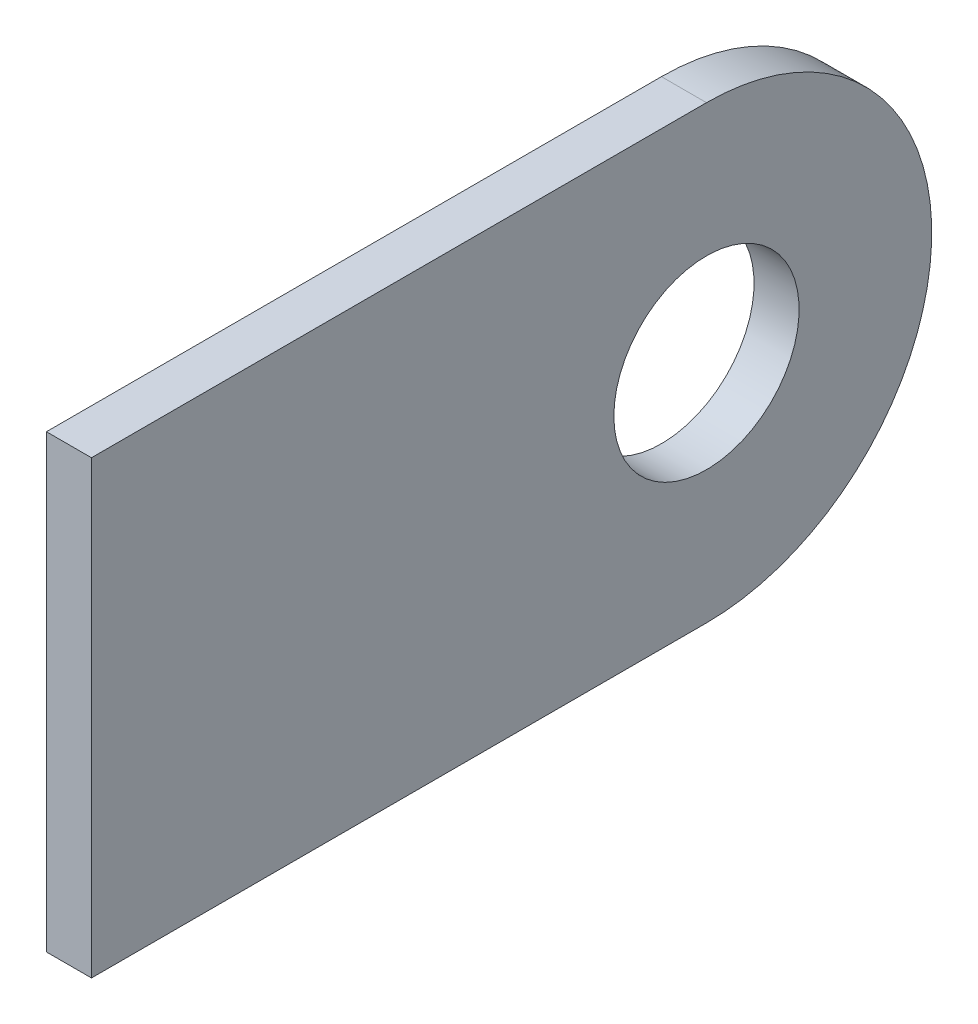
ISO-10303-21;
HEADER;
FILE_DESCRIPTION(('STEP AP214'),'2;1');
FILE_NAME('part.step','',(''),(''),'','','');
FILE_SCHEMA(('AUTOMOTIVE_DESIGN { 1 0 10303 214 1 1 1 1 }'));
ENDSEC;
DATA;
#1=APPLICATION_CONTEXT('core data for automotive mechanical design processes');
#2=APPLICATION_PROTOCOL_DEFINITION('international standard','automotive_design',2000,#1);
#3=PRODUCT_CONTEXT('',#1,'mechanical');
#4=PRODUCT('Part','Part','',(#3));
#5=PRODUCT_RELATED_PRODUCT_CATEGORY('part','',(#4));
#6=PRODUCT_DEFINITION_FORMATION('','',#4);
#7=PRODUCT_DEFINITION_CONTEXT('part definition',#1,'design');
#8=PRODUCT_DEFINITION('design','',#6,#7);
#9=PRODUCT_DEFINITION_SHAPE('','',#8);
#10=(LENGTH_UNIT() NAMED_UNIT(*) SI_UNIT(.MILLI.,.METRE.));
#11=(NAMED_UNIT(*) PLANE_ANGLE_UNIT() SI_UNIT($,.RADIAN.));
#12=(NAMED_UNIT(*) SI_UNIT($,.STERADIAN.) SOLID_ANGLE_UNIT());
#13=UNCERTAINTY_MEASURE_WITH_UNIT(LENGTH_MEASURE(1.E-05),#10,'distance_accuracy_value','');
#14=(GEOMETRIC_REPRESENTATION_CONTEXT(3) GLOBAL_UNCERTAINTY_ASSIGNED_CONTEXT((#13)) GLOBAL_UNIT_ASSIGNED_CONTEXT((#10,
#11,#12)) REPRESENTATION_CONTEXT('',''));
#15=CARTESIAN_POINT('',(0.,0.,0.));
#16=DIRECTION('',(0.,0.,1.));
#17=DIRECTION('',(1.,0.,0.));
#18=AXIS2_PLACEMENT_3D('',#15,#16,#17);
#19=CARTESIAN_POINT('',(0.,0.,-18.49374));
#20=DIRECTION('',(-1.,0.,0.));
#21=DIRECTION('',(0.,0.,-1.));
#22=AXIS2_PLACEMENT_3D('',#19,#20,#21);
#23=PLANE('',#22);
#24=DIRECTION('',(0.,0.,-1.));
#25=VECTOR('',#24,1.);
#26=CARTESIAN_POINT('',(0.,7.93749999999761,-18.49374));
#27=LINE('',#26,#25);
#28=CARTESIAN_POINT('',(0.,7.9374999999976,3.175));
#29=VERTEX_POINT('',#28);
#30=CARTESIAN_POINT('',(0.,7.93749999999761,-18.49374));
#31=VERTEX_POINT('',#30);
#32=EDGE_CURVE('E107',#29,#31,#27,.T.);
#33=ORIENTED_EDGE('',*,*,#32,.T.);
#34=CARTESIAN_POINT('',(0.,0.,-18.49374));
#35=DIRECTION('',(-1.,0.,0.));
#36=DIRECTION('',(0.,0.,-1.));
#37=AXIS2_PLACEMENT_3D('',#34,#35,#36);
#38=CIRCLE('',#37,7.93749999999761);
#39=CARTESIAN_POINT('',(0.,-7.93749999999761,-18.49374));
#40=VERTEX_POINT('',#39);
#41=EDGE_CURVE('E110',#31,#40,#38,.T.);
#42=ORIENTED_EDGE('',*,*,#41,.T.);
#43=DIRECTION('',(0.,0.,1.));
#44=VECTOR('',#43,1.);
#45=CARTESIAN_POINT('',(0.,-7.93749999999761,-18.49374));
#46=LINE('',#45,#44);
#47=CARTESIAN_POINT('',(0.,-7.93749999999761,3.175));
#48=VERTEX_POINT('',#47);
#49=EDGE_CURVE('E94',#40,#48,#46,.T.);
#50=ORIENTED_EDGE('',*,*,#49,.T.);
#51=DIRECTION('',(0.,1.,0.));
#52=VECTOR('',#51,1.);
#53=CARTESIAN_POINT('',(0.,-7.93749999999761,3.175));
#54=LINE('',#53,#52);
#55=EDGE_CURVE('E102',#48,#29,#54,.T.);
#56=ORIENTED_EDGE('',*,*,#55,.T.);
#57=EDGE_LOOP('',(#33,#42,#50,#56));
#58=FACE_BOUND('',#57,.T.);
#59=CARTESIAN_POINT('',(0.,0.,-18.49374));
#60=DIRECTION('',(-1.,0.,0.));
#61=DIRECTION('',(0.,0.,1.));
#62=AXIS2_PLACEMENT_3D('',#59,#60,#61);
#63=CIRCLE('',#62,3.2639);
#64=CARTESIAN_POINT('',(0.,0.,-15.22984));
#65=VERTEX_POINT('',#64);
#66=EDGE_CURVE('E111',#65,#65,#63,.T.);
#67=ORIENTED_EDGE('',*,*,#66,.F.);
#68=EDGE_LOOP('',(#67));
#69=FACE_BOUND('',#68,.T.);
#70=ADVANCED_FACE('F43',(#58,#69),#23,.T.);
#71=CARTESIAN_POINT('',(1.5875,7.93749999999761,-18.49374));
#72=DIRECTION('',(0.,-1.,0.));
#73=DIRECTION('',(0.,0.,1.));
#74=AXIS2_PLACEMENT_3D('',#71,#72,#73);
#75=PLANE('',#74);
#76=ORIENTED_EDGE('',*,*,#32,.F.);
#77=DIRECTION('',(-1.,0.,0.));
#78=VECTOR('',#77,1.);
#79=CARTESIAN_POINT('',(1.5875,7.9374999999976,3.175));
#80=LINE('',#79,#78);
#81=CARTESIAN_POINT('',(1.5875,7.9374999999976,3.175));
#82=VERTEX_POINT('',#81);
#83=EDGE_CURVE('E79',#82,#29,#80,.T.);
#84=ORIENTED_EDGE('',*,*,#83,.F.);
#85=DIRECTION('',(0.,0.,-1.));
#86=VECTOR('',#85,1.);
#87=CARTESIAN_POINT('',(1.5875,7.93749999999761,-18.49374));
#88=LINE('',#87,#86);
#89=CARTESIAN_POINT('',(1.5875,7.93749999999761,-18.49374));
#90=VERTEX_POINT('',#89);
#91=EDGE_CURVE('E100',#82,#90,#88,.T.);
#92=ORIENTED_EDGE('',*,*,#91,.T.);
#93=DIRECTION('',(-1.,0.,0.));
#94=VECTOR('',#93,1.);
#95=CARTESIAN_POINT('',(1.5875,7.93749999999761,-18.49374));
#96=LINE('',#95,#94);
#97=EDGE_CURVE('E11',#90,#31,#96,.T.);
#98=ORIENTED_EDGE('',*,*,#97,.T.);
#99=EDGE_LOOP('',(#76,#84,#92,#98));
#100=FACE_BOUND('',#99,.T.);
#101=ADVANCED_FACE('F45',(#100),#75,.F.);
#102=CARTESIAN_POINT('',(1.5875,0.,-18.49374));
#103=DIRECTION('',(-1.,0.,0.));
#104=DIRECTION('',(0.,0.,-1.));
#105=AXIS2_PLACEMENT_3D('',#102,#103,#104);
#106=CYLINDRICAL_SURFACE('',#105,7.93749999999761);
#107=ORIENTED_EDGE('',*,*,#41,.F.);
#108=ORIENTED_EDGE('',*,*,#97,.F.);
#109=CARTESIAN_POINT('',(1.5875,0.,-18.49374));
#110=DIRECTION('',(-1.,0.,0.));
#111=DIRECTION('',(0.,0.,-1.));
#112=AXIS2_PLACEMENT_3D('',#109,#110,#111);
#113=CIRCLE('',#112,7.93749999999761);
#114=CARTESIAN_POINT('',(1.5875,-7.93749999999761,-18.49374));
#115=VERTEX_POINT('',#114);
#116=EDGE_CURVE('E86',#90,#115,#113,.T.);
#117=ORIENTED_EDGE('',*,*,#116,.T.);
#118=DIRECTION('',(-1.,0.,0.));
#119=VECTOR('',#118,1.);
#120=CARTESIAN_POINT('',(1.5875,-7.93749999999761,-18.49374));
#121=LINE('',#120,#119);
#122=EDGE_CURVE('E52',#115,#40,#121,.T.);
#123=ORIENTED_EDGE('',*,*,#122,.T.);
#124=EDGE_LOOP('',(#107,#108,#117,#123));
#125=FACE_BOUND('',#124,.T.);
#126=ADVANCED_FACE('F98',(#125),#106,.T.);
#127=CARTESIAN_POINT('',(1.5875,-7.93749999999761,-18.49374));
#128=DIRECTION('',(0.,1.,0.));
#129=DIRECTION('',(0.,0.,-1.));
#130=AXIS2_PLACEMENT_3D('',#127,#128,#129);
#131=PLANE('',#130);
#132=ORIENTED_EDGE('',*,*,#49,.F.);
#133=ORIENTED_EDGE('',*,*,#122,.F.);
#134=DIRECTION('',(0.,0.,1.));
#135=VECTOR('',#134,1.);
#136=CARTESIAN_POINT('',(1.5875,-7.93749999999761,-18.49374));
#137=LINE('',#136,#135);
#138=CARTESIAN_POINT('',(1.5875,-7.93749999999761,3.175));
#139=VERTEX_POINT('',#138);
#140=EDGE_CURVE('E88',#115,#139,#137,.T.);
#141=ORIENTED_EDGE('',*,*,#140,.T.);
#142=DIRECTION('',(-1.,0.,0.));
#143=VECTOR('',#142,1.);
#144=CARTESIAN_POINT('',(1.5875,-7.93749999999761,3.175));
#145=LINE('',#144,#143);
#146=EDGE_CURVE('E75',#139,#48,#145,.T.);
#147=ORIENTED_EDGE('',*,*,#146,.T.);
#148=EDGE_LOOP('',(#132,#133,#141,#147));
#149=FACE_BOUND('',#148,.T.);
#150=ADVANCED_FACE('F92',(#149),#131,.F.);
#151=CARTESIAN_POINT('',(1.5875,-7.93749999999761,3.175));
#152=DIRECTION('',(0.,0.,-1.));
#153=DIRECTION('',(1.,0.,0.));
#154=AXIS2_PLACEMENT_3D('',#151,#152,#153);
#155=PLANE('',#154);
#156=ORIENTED_EDGE('',*,*,#55,.F.);
#157=ORIENTED_EDGE('',*,*,#146,.F.);
#158=DIRECTION('',(0.,1.,0.));
#159=VECTOR('',#158,1.);
#160=CARTESIAN_POINT('',(1.5875,-7.93749999999761,3.175));
#161=LINE('',#160,#159);
#162=EDGE_CURVE('E60',#139,#82,#161,.T.);
#163=ORIENTED_EDGE('',*,*,#162,.T.);
#164=ORIENTED_EDGE('',*,*,#83,.T.);
#165=EDGE_LOOP('',(#156,#157,#163,#164));
#166=FACE_BOUND('',#165,.T.);
#167=ADVANCED_FACE('F131',(#166),#155,.F.);
#168=CARTESIAN_POINT('',(1.5875,0.,-18.49374));
#169=DIRECTION('',(-1.,0.,0.));
#170=DIRECTION('',(0.,0.,-1.));
#171=AXIS2_PLACEMENT_3D('',#168,#169,#170);
#172=PLANE('',#171);
#173=CARTESIAN_POINT('',(1.5875,0.,-18.49374));
#174=DIRECTION('',(-1.,0.,0.));
#175=DIRECTION('',(0.,0.,1.));
#176=AXIS2_PLACEMENT_3D('',#173,#174,#175);
#177=CIRCLE('',#176,3.2639);
#178=CARTESIAN_POINT('',(1.5875,0.,-15.22984));
#179=VERTEX_POINT('',#178);
#180=EDGE_CURVE('E183',#179,#179,#177,.T.);
#181=ORIENTED_EDGE('',*,*,#180,.T.);
#182=EDGE_LOOP('',(#181));
#183=FACE_BOUND('',#182,.T.);
#184=ORIENTED_EDGE('',*,*,#91,.F.);
#185=ORIENTED_EDGE('',*,*,#162,.F.);
#186=ORIENTED_EDGE('',*,*,#140,.F.);
#187=ORIENTED_EDGE('',*,*,#116,.F.);
#188=EDGE_LOOP('',(#184,#185,#186,#187));
#189=FACE_BOUND('',#188,.T.);
#190=ADVANCED_FACE('F90',(#183,#189),#172,.F.);
#191=CARTESIAN_POINT('',(1.5875,0.,-18.49374));
#192=DIRECTION('',(1.,0.,0.));
#193=DIRECTION('',(0.,0.,1.));
#194=AXIS2_PLACEMENT_3D('',#191,#192,#193);
#195=CYLINDRICAL_SURFACE('',#194,3.2639);
#196=ORIENTED_EDGE('',*,*,#66,.T.);
#197=EDGE_LOOP('',(#196));
#198=FACE_BOUND('',#197,.T.);
#199=ORIENTED_EDGE('',*,*,#180,.F.);
#200=EDGE_LOOP('',(#199));
#201=FACE_BOUND('',#200,.T.);
#202=ADVANCED_FACE('F151',(#198,#201),#195,.F.);
#203=CLOSED_SHELL('',(#70,#101,#126,#150,#167,#190,#202));
#204=MANIFOLD_SOLID_BREP('B2',#203);
#205=ADVANCED_BREP_SHAPE_REPRESENTATION('',(#18,#204),#14);
#206=SHAPE_DEFINITION_REPRESENTATION(#9,#205);
ENDSEC;
END-ISO-10303-21;
